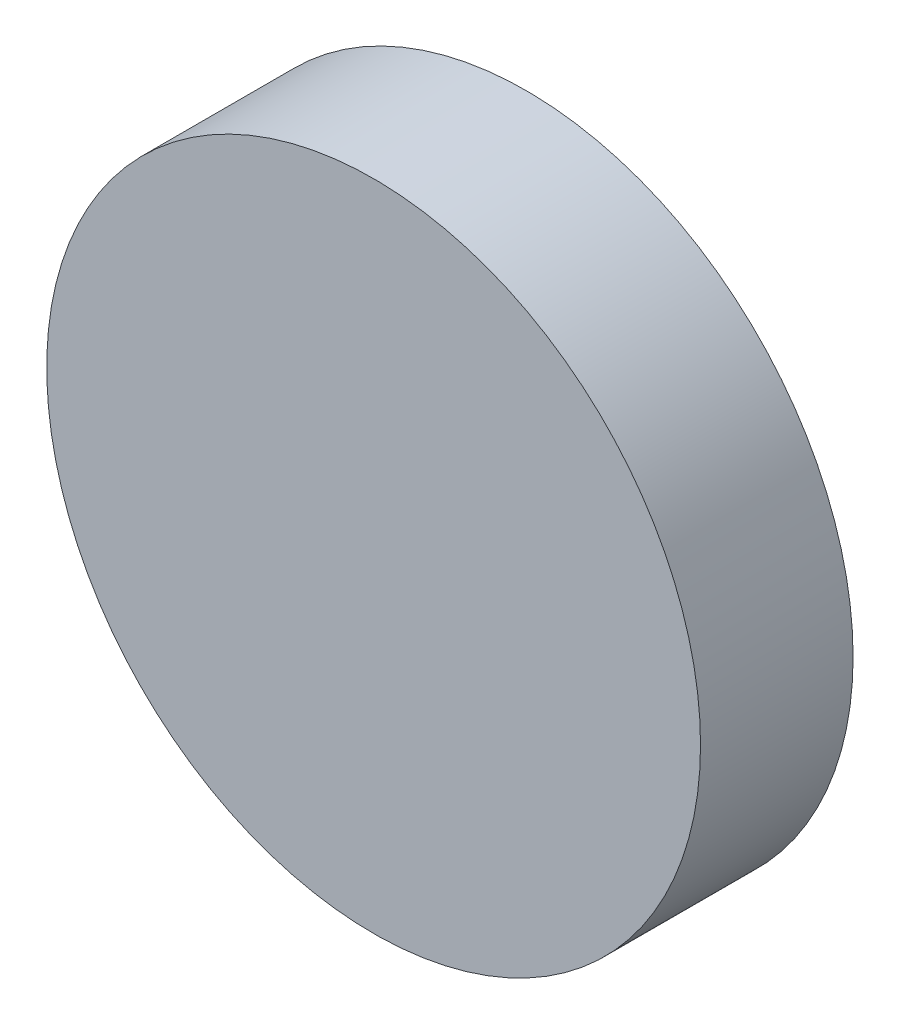
ISO-10303-21;
HEADER;
FILE_DESCRIPTION(('STEP AP214'),'2;1');
FILE_NAME('part.step','',(''),(''),'','','');
FILE_SCHEMA(('AUTOMOTIVE_DESIGN { 1 0 10303 214 1 1 1 1 }'));
ENDSEC;
DATA;
#1=APPLICATION_CONTEXT('core data for automotive mechanical design processes');
#2=APPLICATION_PROTOCOL_DEFINITION('international standard','automotive_design',2000,#1);
#3=PRODUCT_CONTEXT('',#1,'mechanical');
#4=PRODUCT('Part','Part','',(#3));
#5=PRODUCT_RELATED_PRODUCT_CATEGORY('part','',(#4));
#6=PRODUCT_DEFINITION_FORMATION('','',#4);
#7=PRODUCT_DEFINITION_CONTEXT('part definition',#1,'design');
#8=PRODUCT_DEFINITION('design','',#6,#7);
#9=PRODUCT_DEFINITION_SHAPE('','',#8);
#10=(LENGTH_UNIT() NAMED_UNIT(*) SI_UNIT(.MILLI.,.METRE.));
#11=(NAMED_UNIT(*) PLANE_ANGLE_UNIT() SI_UNIT($,.RADIAN.));
#12=(NAMED_UNIT(*) SI_UNIT($,.STERADIAN.) SOLID_ANGLE_UNIT());
#13=UNCERTAINTY_MEASURE_WITH_UNIT(LENGTH_MEASURE(1.E-05),#10,'distance_accuracy_value','');
#14=(GEOMETRIC_REPRESENTATION_CONTEXT(3) GLOBAL_UNCERTAINTY_ASSIGNED_CONTEXT((#13)) GLOBAL_UNIT_ASSIGNED_CONTEXT((#10,
#11,#12)) REPRESENTATION_CONTEXT('',''));
#15=CARTESIAN_POINT('',(0.,0.,0.));
#16=DIRECTION('',(0.,0.,1.));
#17=DIRECTION('',(1.,0.,0.));
#18=AXIS2_PLACEMENT_3D('',#15,#16,#17);
#19=CARTESIAN_POINT('',(10.2,0.,-7.));
#20=DIRECTION('',(0.,0.,-1.));
#21=DIRECTION('',(-1.,0.,0.));
#22=AXIS2_PLACEMENT_3D('',#19,#20,#21);
#23=PLANE('',#22);
#24=CARTESIAN_POINT('',(0.,0.,-7.));
#25=DIRECTION('',(0.,0.,1.));
#26=DIRECTION('',(1.,0.,0.));
#27=AXIS2_PLACEMENT_3D('',#24,#25,#26);
#28=CIRCLE('',#27,9.);
#29=CARTESIAN_POINT('',(9.,0.,-7.));
#30=VERTEX_POINT('',#29);
#31=EDGE_CURVE('E10',#30,#30,#28,.T.);
#32=ORIENTED_EDGE('',*,*,#31,.T.);
#33=EDGE_LOOP('',(#32));
#34=FACE_BOUND('',#33,.T.);
#35=CARTESIAN_POINT('',(0.,0.,-7.));
#36=DIRECTION('',(0.,0.,1.));
#37=DIRECTION('',(1.,0.,0.));
#38=AXIS2_PLACEMENT_3D('',#35,#36,#37);
#39=CIRCLE('',#38,15.);
#40=CARTESIAN_POINT('',(15.,0.,-7.));
#41=VERTEX_POINT('',#40);
#42=EDGE_CURVE('E56',#41,#41,#39,.T.);
#43=ORIENTED_EDGE('',*,*,#42,.F.);
#44=EDGE_LOOP('',(#43));
#45=FACE_BOUND('',#44,.T.);
#46=ADVANCED_FACE('F40',(#34,#45),#23,.T.);
#47=CARTESIAN_POINT('',(0.,0.,-2.));
#48=DIRECTION('',(0.,0.,1.));
#49=DIRECTION('',(1.,0.,0.));
#50=AXIS2_PLACEMENT_3D('',#47,#48,#49);
#51=PLANE('',#50);
#52=CARTESIAN_POINT('',(0.,0.,-2.));
#53=DIRECTION('',(0.,0.,1.));
#54=DIRECTION('',(1.,0.,0.));
#55=AXIS2_PLACEMENT_3D('',#52,#53,#54);
#56=CIRCLE('',#55,9.);
#57=CARTESIAN_POINT('',(9.,0.,-2.));
#58=VERTEX_POINT('',#57);
#59=EDGE_CURVE('E48',#58,#58,#56,.T.);
#60=ORIENTED_EDGE('',*,*,#59,.F.);
#61=EDGE_LOOP('',(#60));
#62=FACE_BOUND('',#61,.T.);
#63=ADVANCED_FACE('F74',(#62),#51,.F.);
#64=CARTESIAN_POINT('',(0.,0.,-7.));
#65=DIRECTION('',(0.,0.,1.));
#66=DIRECTION('',(1.,0.,0.));
#67=AXIS2_PLACEMENT_3D('',#64,#65,#66);
#68=CYLINDRICAL_SURFACE('',#67,9.);
#69=ORIENTED_EDGE('',*,*,#31,.F.);
#70=EDGE_LOOP('',(#69));
#71=FACE_BOUND('',#70,.T.);
#72=ORIENTED_EDGE('',*,*,#59,.T.);
#73=EDGE_LOOP('',(#72));
#74=FACE_BOUND('',#73,.T.);
#75=ADVANCED_FACE('F67',(#71,#74),#68,.F.);
#76=CARTESIAN_POINT('',(0.,0.,-7.));
#77=DIRECTION('',(0.,0.,1.));
#78=DIRECTION('',(1.,0.,0.));
#79=AXIS2_PLACEMENT_3D('',#76,#77,#78);
#80=CYLINDRICAL_SURFACE('',#79,15.);
#81=CARTESIAN_POINT('',(0.,0.,0.));
#82=DIRECTION('',(0.,0.,1.));
#83=DIRECTION('',(1.,0.,0.));
#84=AXIS2_PLACEMENT_3D('',#81,#82,#83);
#85=CIRCLE('',#84,15.);
#86=CARTESIAN_POINT('',(15.,0.,0.));
#87=VERTEX_POINT('',#86);
#88=EDGE_CURVE('E43',#87,#87,#85,.T.);
#89=ORIENTED_EDGE('',*,*,#88,.F.);
#90=EDGE_LOOP('',(#89));
#91=FACE_BOUND('',#90,.T.);
#92=ORIENTED_EDGE('',*,*,#42,.T.);
#93=EDGE_LOOP('',(#92));
#94=FACE_BOUND('',#93,.T.);
#95=ADVANCED_FACE('F65',(#91,#94),#80,.T.);
#96=CARTESIAN_POINT('',(0.,0.,0.));
#97=DIRECTION('',(0.,0.,1.));
#98=DIRECTION('',(1.,0.,0.));
#99=AXIS2_PLACEMENT_3D('',#96,#97,#98);
#100=PLANE('',#99);
#101=ORIENTED_EDGE('',*,*,#88,.T.);
#102=EDGE_LOOP('',(#101));
#103=FACE_BOUND('',#102,.T.);
#104=ADVANCED_FACE('F63',(#103),#100,.T.);
#105=CLOSED_SHELL('',(#46,#63,#75,#95,#104));
#106=MANIFOLD_SOLID_BREP('B2',#105);
#107=ADVANCED_BREP_SHAPE_REPRESENTATION('',(#18,#106),#14);
#108=SHAPE_DEFINITION_REPRESENTATION(#9,#107);
ENDSEC;
END-ISO-10303-21;
